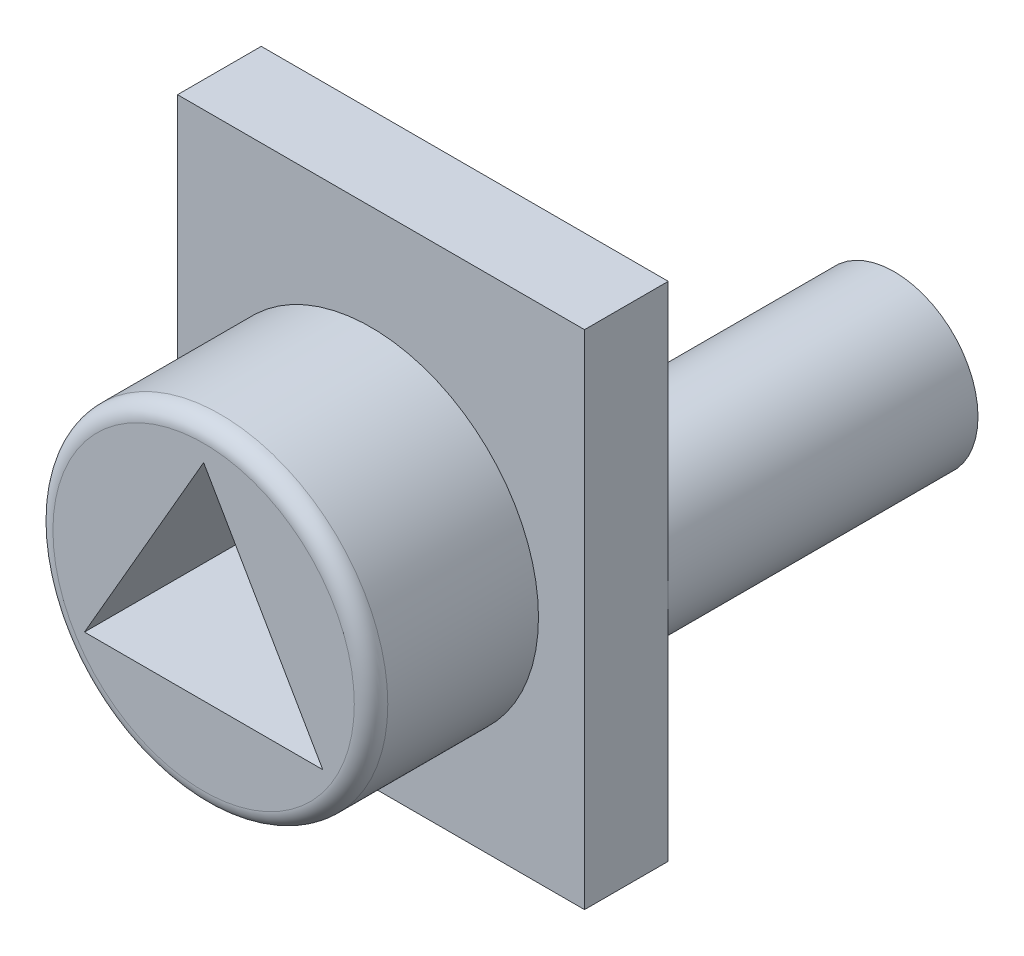
ISO-10303-21;
HEADER;
FILE_DESCRIPTION(('STEP AP214'),'2;1');
FILE_NAME('part.step','',(''),(''),'','','');
FILE_SCHEMA(('AUTOMOTIVE_DESIGN { 1 0 10303 214 1 1 1 1 }'));
ENDSEC;
DATA;
#1=APPLICATION_CONTEXT('core data for automotive mechanical design processes');
#2=APPLICATION_PROTOCOL_DEFINITION('international standard','automotive_design',2000,#1);
#3=PRODUCT_CONTEXT('',#1,'mechanical');
#4=PRODUCT('Part','Part','',(#3));
#5=PRODUCT_RELATED_PRODUCT_CATEGORY('part','',(#4));
#6=PRODUCT_DEFINITION_FORMATION('','',#4);
#7=PRODUCT_DEFINITION_CONTEXT('part definition',#1,'design');
#8=PRODUCT_DEFINITION('design','',#6,#7);
#9=PRODUCT_DEFINITION_SHAPE('','',#8);
#10=(LENGTH_UNIT() NAMED_UNIT(*) SI_UNIT(.MILLI.,.METRE.));
#11=(NAMED_UNIT(*) PLANE_ANGLE_UNIT() SI_UNIT($,.RADIAN.));
#12=(NAMED_UNIT(*) SI_UNIT($,.STERADIAN.) SOLID_ANGLE_UNIT());
#13=UNCERTAINTY_MEASURE_WITH_UNIT(LENGTH_MEASURE(1.E-05),#10,'distance_accuracy_value','');
#14=(GEOMETRIC_REPRESENTATION_CONTEXT(3) GLOBAL_UNCERTAINTY_ASSIGNED_CONTEXT((#13)) GLOBAL_UNIT_ASSIGNED_CONTEXT((#10,
#11,#12)) REPRESENTATION_CONTEXT('',''));
#15=CARTESIAN_POINT('',(0.,0.,0.));
#16=DIRECTION('',(0.,0.,1.));
#17=DIRECTION('',(1.,0.,0.));
#18=AXIS2_PLACEMENT_3D('',#15,#16,#17);
#19=CARTESIAN_POINT('',(0.,0.,2.));
#20=DIRECTION('',(0.,0.,1.));
#21=DIRECTION('',(1.,0.,0.));
#22=AXIS2_PLACEMENT_3D('',#19,#20,#21);
#23=PLANE('',#22);
#24=DIRECTION('',(0.,-1.,0.));
#25=VECTOR('',#24,1.);
#26=CARTESIAN_POINT('',(-4.86158362662732,6.,2.));
#27=LINE('',#26,#25);
#28=CARTESIAN_POINT('',(-4.86158362662732,6.,2.));
#29=VERTEX_POINT('',#28);
#30=CARTESIAN_POINT('',(-4.86158362662732,-6.,2.));
#31=VERTEX_POINT('',#30);
#32=EDGE_CURVE('E122',#29,#31,#27,.T.);
#33=ORIENTED_EDGE('',*,*,#32,.T.);
#34=DIRECTION('',(1.,0.,0.));
#35=VECTOR('',#34,1.);
#36=CARTESIAN_POINT('',(-4.86158362662732,-6.,2.));
#37=LINE('',#36,#35);
#38=CARTESIAN_POINT('',(4.86158362662732,-6.,2.));
#39=VERTEX_POINT('',#38);
#40=EDGE_CURVE('E217',#31,#39,#37,.T.);
#41=ORIENTED_EDGE('',*,*,#40,.T.);
#42=DIRECTION('',(0.,1.,0.));
#43=VECTOR('',#42,1.);
#44=CARTESIAN_POINT('',(4.86158362662732,-6.,2.));
#45=LINE('',#44,#43);
#46=CARTESIAN_POINT('',(4.86158362662732,6.,2.));
#47=VERTEX_POINT('',#46);
#48=EDGE_CURVE('E219',#39,#47,#45,.T.);
#49=ORIENTED_EDGE('',*,*,#48,.T.);
#50=DIRECTION('',(-1.,0.,0.));
#51=VECTOR('',#50,1.);
#52=CARTESIAN_POINT('',(4.86158362662732,6.,2.));
#53=LINE('',#52,#51);
#54=EDGE_CURVE('E127',#47,#29,#53,.T.);
#55=ORIENTED_EDGE('',*,*,#54,.T.);
#56=EDGE_LOOP('',(#33,#41,#49,#55));
#57=FACE_BOUND('',#56,.T.);
#58=CARTESIAN_POINT('',(-0.238416373372685,-0.5,2.));
#59=DIRECTION('',(0.,0.,1.));
#60=DIRECTION('',(1.,0.,0.));
#61=AXIS2_PLACEMENT_3D('',#58,#59,#60);
#62=CIRCLE('',#61,4.00000000000001);
#63=CARTESIAN_POINT('',(3.76158362662732,-0.5,2.));
#64=VERTEX_POINT('',#63);
#65=EDGE_CURVE('E213',#64,#64,#62,.T.);
#66=ORIENTED_EDGE('',*,*,#65,.F.);
#67=EDGE_LOOP('',(#66));
#68=FACE_BOUND('',#67,.T.);
#69=ADVANCED_FACE('F38',(#57,#68),#23,.T.);
#70=CARTESIAN_POINT('',(-4.86158362662732,6.,2.));
#71=DIRECTION('',(1.,0.,0.));
#72=DIRECTION('',(0.,0.,-1.));
#73=AXIS2_PLACEMENT_3D('',#70,#71,#72);
#74=PLANE('',#73);
#75=DIRECTION('',(0.,-1.,0.));
#76=VECTOR('',#75,1.);
#77=CARTESIAN_POINT('',(-4.86158362662732,6.,0.));
#78=LINE('',#77,#76);
#79=CARTESIAN_POINT('',(-4.86158362662732,6.,0.));
#80=VERTEX_POINT('',#79);
#81=CARTESIAN_POINT('',(-4.86158362662732,-6.,0.));
#82=VERTEX_POINT('',#81);
#83=EDGE_CURVE('E117',#80,#82,#78,.T.);
#84=ORIENTED_EDGE('',*,*,#83,.T.);
#85=DIRECTION('',(0.,0.,-1.));
#86=VECTOR('',#85,1.);
#87=CARTESIAN_POINT('',(-4.86158362662732,-6.,2.));
#88=LINE('',#87,#86);
#89=EDGE_CURVE('E130',#31,#82,#88,.T.);
#90=ORIENTED_EDGE('',*,*,#89,.F.);
#91=ORIENTED_EDGE('',*,*,#32,.F.);
#92=DIRECTION('',(0.,0.,-1.));
#93=VECTOR('',#92,1.);
#94=CARTESIAN_POINT('',(-4.86158362662732,6.,2.));
#95=LINE('',#94,#93);
#96=EDGE_CURVE('E123',#29,#80,#95,.T.);
#97=ORIENTED_EDGE('',*,*,#96,.T.);
#98=EDGE_LOOP('',(#84,#90,#91,#97));
#99=FACE_BOUND('',#98,.T.);
#100=ADVANCED_FACE('F153',(#99),#74,.F.);
#101=CARTESIAN_POINT('',(-4.86158362662732,-6.,2.));
#102=DIRECTION('',(0.,1.,0.));
#103=DIRECTION('',(0.,0.,1.));
#104=AXIS2_PLACEMENT_3D('',#101,#102,#103);
#105=PLANE('',#104);
#106=DIRECTION('',(1.,0.,0.));
#107=VECTOR('',#106,1.);
#108=CARTESIAN_POINT('',(-4.86158362662732,-6.,0.));
#109=LINE('',#108,#107);
#110=CARTESIAN_POINT('',(4.86158362662732,-6.,0.));
#111=VERTEX_POINT('',#110);
#112=EDGE_CURVE('E116',#82,#111,#109,.T.);
#113=ORIENTED_EDGE('',*,*,#112,.T.);
#114=DIRECTION('',(0.,0.,-1.));
#115=VECTOR('',#114,1.);
#116=CARTESIAN_POINT('',(4.86158362662732,-6.,2.));
#117=LINE('',#116,#115);
#118=EDGE_CURVE('E106',#39,#111,#117,.T.);
#119=ORIENTED_EDGE('',*,*,#118,.F.);
#120=ORIENTED_EDGE('',*,*,#40,.F.);
#121=ORIENTED_EDGE('',*,*,#89,.T.);
#122=EDGE_LOOP('',(#113,#119,#120,#121));
#123=FACE_BOUND('',#122,.T.);
#124=ADVANCED_FACE('F160',(#123),#105,.F.);
#125=CARTESIAN_POINT('',(4.86158362662732,-6.,2.));
#126=DIRECTION('',(-1.,0.,0.));
#127=DIRECTION('',(0.,0.,1.));
#128=AXIS2_PLACEMENT_3D('',#125,#126,#127);
#129=PLANE('',#128);
#130=DIRECTION('',(0.,1.,0.));
#131=VECTOR('',#130,1.);
#132=CARTESIAN_POINT('',(4.86158362662732,-6.,0.));
#133=LINE('',#132,#131);
#134=CARTESIAN_POINT('',(4.86158362662732,-0.5,0.));
#135=VERTEX_POINT('',#134);
#136=EDGE_CURVE('E98',#111,#135,#133,.T.);
#137=ORIENTED_EDGE('',*,*,#136,.T.);
#138=CARTESIAN_POINT('',(4.86158362662732,6.,0.));
#139=VERTEX_POINT('',#138);
#140=EDGE_CURVE('E102',#135,#139,#133,.T.);
#141=ORIENTED_EDGE('',*,*,#140,.T.);
#142=DIRECTION('',(0.,0.,-1.));
#143=VECTOR('',#142,1.);
#144=CARTESIAN_POINT('',(4.86158362662732,6.,2.));
#145=LINE('',#144,#143);
#146=EDGE_CURVE('E126',#47,#139,#145,.T.);
#147=ORIENTED_EDGE('',*,*,#146,.F.);
#148=ORIENTED_EDGE('',*,*,#48,.F.);
#149=ORIENTED_EDGE('',*,*,#118,.T.);
#150=EDGE_LOOP('',(#137,#141,#147,#148,#149));
#151=FACE_BOUND('',#150,.T.);
#152=ADVANCED_FACE('F100',(#151),#129,.F.);
#153=CARTESIAN_POINT('',(4.86158362662732,6.,2.));
#154=DIRECTION('',(0.,-1.,0.));
#155=DIRECTION('',(0.,0.,-1.));
#156=AXIS2_PLACEMENT_3D('',#153,#154,#155);
#157=PLANE('',#156);
#158=DIRECTION('',(-1.,0.,0.));
#159=VECTOR('',#158,1.);
#160=CARTESIAN_POINT('',(4.86158362662732,6.,0.));
#161=LINE('',#160,#159);
#162=EDGE_CURVE('E109',#139,#80,#161,.T.);
#163=ORIENTED_EDGE('',*,*,#162,.T.);
#164=ORIENTED_EDGE('',*,*,#96,.F.);
#165=ORIENTED_EDGE('',*,*,#54,.F.);
#166=ORIENTED_EDGE('',*,*,#146,.T.);
#167=EDGE_LOOP('',(#163,#164,#165,#166));
#168=FACE_BOUND('',#167,.T.);
#169=ADVANCED_FACE('F228',(#168),#157,.F.);
#170=CARTESIAN_POINT('',(0.,0.,0.));
#171=DIRECTION('',(0.,0.,1.));
#172=DIRECTION('',(1.,0.,0.));
#173=AXIS2_PLACEMENT_3D('',#170,#171,#172);
#174=PLANE('',#173);
#175=CARTESIAN_POINT('',(-0.238416373372673,-0.580000000000002,0.));
#176=DIRECTION('',(0.,0.,1.));
#177=DIRECTION('',(1.,0.,0.));
#178=AXIS2_PLACEMENT_3D('',#175,#176,#177);
#179=CIRCLE('',#178,1.1);
#180=CARTESIAN_POINT('',(0.861583626627327,-0.580000000000002,0.));
#181=VERTEX_POINT('',#180);
#182=EDGE_CURVE('E184',#181,#181,#179,.T.);
#183=ORIENTED_EDGE('',*,*,#182,.T.);
#184=EDGE_LOOP('',(#183));
#185=FACE_BOUND('',#184,.T.);
#186=ORIENTED_EDGE('',*,*,#140,.F.);
#187=CARTESIAN_POINT('',(2.86158362662732,-0.5,0.));
#188=DIRECTION('',(0.,0.,-1.));
#189=DIRECTION('',(-1.,0.,0.));
#190=AXIS2_PLACEMENT_3D('',#187,#188,#189);
#191=CIRCLE('',#190,2.);
#192=EDGE_CURVE('E114',#135,#135,#191,.T.);
#193=ORIENTED_EDGE('',*,*,#192,.F.);
#194=ORIENTED_EDGE('',*,*,#136,.F.);
#195=ORIENTED_EDGE('',*,*,#112,.F.);
#196=ORIENTED_EDGE('',*,*,#83,.F.);
#197=ORIENTED_EDGE('',*,*,#162,.F.);
#198=EDGE_LOOP('',(#186,#193,#194,#195,#196,#197));
#199=FACE_BOUND('',#198,.T.);
#200=ADVANCED_FACE('F112',(#185,#199),#174,.F.);
#201=CARTESIAN_POINT('',(-0.238416373372685,-0.5,6.));
#202=DIRECTION('',(0.,0.,1.));
#203=DIRECTION('',(1.,0.,0.));
#204=AXIS2_PLACEMENT_3D('',#201,#202,#203);
#205=PLANE('',#204);
#206=CARTESIAN_POINT('',(-0.238416373372685,-0.5,6.));
#207=DIRECTION('',(0.,0.,1.));
#208=DIRECTION('',(1.,0.,0.));
#209=AXIS2_PLACEMENT_3D('',#206,#207,#208);
#210=CIRCLE('',#209,3.60000000000001);
#211=CARTESIAN_POINT('',(3.36158362662732,-0.5,6.));
#212=VERTEX_POINT('',#211);
#213=EDGE_CURVE('E46',#212,#212,#210,.T.);
#214=ORIENTED_EDGE('',*,*,#213,.T.);
#215=EDGE_LOOP('',(#214));
#216=FACE_BOUND('',#215,.T.);
#217=DIRECTION('',(-0.5,0.866025403784439,0.));
#218=VECTOR('',#217,1.);
#219=CARTESIAN_POINT('',(-0.238416373372674,2.7,6.));
#220=LINE('',#219,#218);
#221=CARTESIAN_POINT('',(2.60799378814109,-2.23012701892218,6.));
#222=VERTEX_POINT('',#221);
#223=CARTESIAN_POINT('',(-0.238416373372674,2.7,6.));
#224=VERTEX_POINT('',#223);
#225=EDGE_CURVE('E195',#222,#224,#220,.T.);
#226=ORIENTED_EDGE('',*,*,#225,.F.);
#227=DIRECTION('',(1.,0.,0.));
#228=VECTOR('',#227,1.);
#229=CARTESIAN_POINT('',(2.60799378814109,-2.23012701892218,6.));
#230=LINE('',#229,#228);
#231=CARTESIAN_POINT('',(-3.08482653488644,-2.23012701892218,6.));
#232=VERTEX_POINT('',#231);
#233=EDGE_CURVE('E193',#232,#222,#230,.T.);
#234=ORIENTED_EDGE('',*,*,#233,.F.);
#235=DIRECTION('',(-0.5,-0.866025403784439,0.));
#236=VECTOR('',#235,1.);
#237=CARTESIAN_POINT('',(-3.08482653488644,-2.23012701892218,6.));
#238=LINE('',#237,#236);
#239=EDGE_CURVE('E198',#224,#232,#238,.T.);
#240=ORIENTED_EDGE('',*,*,#239,.F.);
#241=EDGE_LOOP('',(#226,#234,#240));
#242=FACE_BOUND('',#241,.T.);
#243=ADVANCED_FACE('F135',(#216,#242),#205,.T.);
#244=CARTESIAN_POINT('',(-0.238416373372685,-0.5,6.));
#245=DIRECTION('',(0.,0.,-1.));
#246=DIRECTION('',(-1.,0.,0.));
#247=AXIS2_PLACEMENT_3D('',#244,#245,#246);
#248=CYLINDRICAL_SURFACE('',#247,4.00000000000001);
#249=CARTESIAN_POINT('',(-0.238416373372685,-0.5,5.6));
#250=DIRECTION('',(0.,0.,1.));
#251=DIRECTION('',(1.,0.,0.));
#252=AXIS2_PLACEMENT_3D('',#249,#250,#251);
#253=CIRCLE('',#252,4.00000000000001);
#254=CARTESIAN_POINT('',(3.76158362662732,-0.5,5.6));
#255=VERTEX_POINT('',#254);
#256=EDGE_CURVE('E11',#255,#255,#253,.F.);
#257=ORIENTED_EDGE('',*,*,#256,.T.);
#258=EDGE_LOOP('',(#257));
#259=FACE_BOUND('',#258,.T.);
#260=ORIENTED_EDGE('',*,*,#65,.T.);
#261=EDGE_LOOP('',(#260));
#262=FACE_BOUND('',#261,.T.);
#263=ADVANCED_FACE('F276',(#259,#262),#248,.T.);
#264=CARTESIAN_POINT('',(2.60799378814109,-2.23012701892218,6.));
#265=DIRECTION('',(0.,1.,0.));
#266=DIRECTION('',(-1.,0.,0.));
#267=AXIS2_PLACEMENT_3D('',#264,#265,#266);
#268=PLANE('',#267);
#269=DIRECTION('',(1.,0.,0.));
#270=VECTOR('',#269,1.);
#271=CARTESIAN_POINT('',(2.60799378814109,-2.23012701892218,2.));
#272=LINE('',#271,#270);
#273=CARTESIAN_POINT('',(-3.08482653488644,-2.23012701892218,2.));
#274=VERTEX_POINT('',#273);
#275=CARTESIAN_POINT('',(2.60799378814109,-2.23012701892218,2.));
#276=VERTEX_POINT('',#275);
#277=EDGE_CURVE('E53',#274,#276,#272,.T.);
#278=ORIENTED_EDGE('',*,*,#277,.F.);
#279=DIRECTION('',(0.,0.,-1.));
#280=VECTOR('',#279,1.);
#281=CARTESIAN_POINT('',(-3.08482653488644,-2.23012701892218,6.));
#282=LINE('',#281,#280);
#283=EDGE_CURVE('E200',#232,#274,#282,.T.);
#284=ORIENTED_EDGE('',*,*,#283,.F.);
#285=ORIENTED_EDGE('',*,*,#233,.T.);
#286=DIRECTION('',(0.,0.,-1.));
#287=VECTOR('',#286,1.);
#288=CARTESIAN_POINT('',(2.60799378814109,-2.23012701892218,6.));
#289=LINE('',#288,#287);
#290=EDGE_CURVE('E210',#222,#276,#289,.T.);
#291=ORIENTED_EDGE('',*,*,#290,.T.);
#292=EDGE_LOOP('',(#278,#284,#285,#291));
#293=FACE_BOUND('',#292,.T.);
#294=ADVANCED_FACE('F282',(#293),#268,.T.);
#295=CARTESIAN_POINT('',(-0.238416373372674,2.7,6.));
#296=DIRECTION('',(-0.866025403784439,-0.5,0.));
#297=DIRECTION('',(0.5,-0.866025403784439,0.));
#298=AXIS2_PLACEMENT_3D('',#295,#296,#297);
#299=PLANE('',#298);
#300=DIRECTION('',(-0.5,0.866025403784439,0.));
#301=VECTOR('',#300,1.);
#302=CARTESIAN_POINT('',(-0.238416373372674,2.7,2.));
#303=LINE('',#302,#301);
#304=CARTESIAN_POINT('',(-0.238416373372674,2.7,2.));
#305=VERTEX_POINT('',#304);
#306=EDGE_CURVE('E202',#276,#305,#303,.T.);
#307=ORIENTED_EDGE('',*,*,#306,.F.);
#308=ORIENTED_EDGE('',*,*,#290,.F.);
#309=ORIENTED_EDGE('',*,*,#225,.T.);
#310=DIRECTION('',(0.,0.,-1.));
#311=VECTOR('',#310,1.);
#312=CARTESIAN_POINT('',(-0.238416373372674,2.7,6.));
#313=LINE('',#312,#311);
#314=EDGE_CURVE('E207',#224,#305,#313,.T.);
#315=ORIENTED_EDGE('',*,*,#314,.T.);
#316=EDGE_LOOP('',(#307,#308,#309,#315));
#317=FACE_BOUND('',#316,.T.);
#318=ADVANCED_FACE('F177',(#317),#299,.T.);
#319=CARTESIAN_POINT('',(-3.08482653488644,-2.23012701892218,6.));
#320=DIRECTION('',(0.866025403784439,-0.5,0.));
#321=DIRECTION('',(0.5,0.866025403784439,0.));
#322=AXIS2_PLACEMENT_3D('',#319,#320,#321);
#323=PLANE('',#322);
#324=DIRECTION('',(-0.5,-0.866025403784439,0.));
#325=VECTOR('',#324,1.);
#326=CARTESIAN_POINT('',(-3.08482653488644,-2.23012701892218,2.));
#327=LINE('',#326,#325);
#328=EDGE_CURVE('E57',#305,#274,#327,.T.);
#329=ORIENTED_EDGE('',*,*,#328,.F.);
#330=ORIENTED_EDGE('',*,*,#314,.F.);
#331=ORIENTED_EDGE('',*,*,#239,.T.);
#332=ORIENTED_EDGE('',*,*,#283,.T.);
#333=EDGE_LOOP('',(#329,#330,#331,#332));
#334=FACE_BOUND('',#333,.T.);
#335=ADVANCED_FACE('F167',(#334),#323,.T.);
#336=CARTESIAN_POINT('',(-0.238416373372673,-0.580000000000002,2.));
#337=DIRECTION('',(0.,0.,1.));
#338=DIRECTION('',(1.,0.,0.));
#339=AXIS2_PLACEMENT_3D('',#336,#337,#338);
#340=CIRCLE('',#339,1.1);
#341=CARTESIAN_POINT('',(0.861583626627327,-0.580000000000002,2.));
#342=VERTEX_POINT('',#341);
#343=EDGE_CURVE('E182',#342,#342,#340,.T.);
#344=ORIENTED_EDGE('',*,*,#343,.F.);
#345=EDGE_LOOP('',(#344));
#346=FACE_BOUND('',#345,.T.);
#347=ORIENTED_EDGE('',*,*,#277,.T.);
#348=ORIENTED_EDGE('',*,*,#306,.T.);
#349=ORIENTED_EDGE('',*,*,#328,.T.);
#350=EDGE_LOOP('',(#347,#348,#349));
#351=FACE_BOUND('',#350,.T.);
#352=ADVANCED_FACE('F156',(#346,#351),#23,.T.);
#353=CARTESIAN_POINT('',(2.86158362662732,-0.5,-7.4));
#354=DIRECTION('',(0.,0.,1.));
#355=DIRECTION('',(1.,0.,0.));
#356=AXIS2_PLACEMENT_3D('',#353,#354,#355);
#357=CYLINDRICAL_SURFACE('',#356,2.);
#358=CARTESIAN_POINT('',(2.86158362662732,-0.5,-7.4));
#359=DIRECTION('',(0.,0.,-1.));
#360=DIRECTION('',(-1.,0.,0.));
#361=AXIS2_PLACEMENT_3D('',#358,#359,#360);
#362=CIRCLE('',#361,2.);
#363=CARTESIAN_POINT('',(0.861583626627324,-0.5,-7.4));
#364=VERTEX_POINT('',#363);
#365=EDGE_CURVE('E189',#364,#364,#362,.T.);
#366=ORIENTED_EDGE('',*,*,#365,.F.);
#367=EDGE_LOOP('',(#366));
#368=FACE_BOUND('',#367,.T.);
#369=ORIENTED_EDGE('',*,*,#192,.T.);
#370=EDGE_LOOP('',(#369));
#371=FACE_BOUND('',#370,.T.);
#372=ADVANCED_FACE('F148',(#368,#371),#357,.T.);
#373=CARTESIAN_POINT('',(2.86158362662732,-0.5,-7.4));
#374=DIRECTION('',(0.,0.,-1.));
#375=DIRECTION('',(-1.,0.,0.));
#376=AXIS2_PLACEMENT_3D('',#373,#374,#375);
#377=PLANE('',#376);
#378=ORIENTED_EDGE('',*,*,#365,.T.);
#379=EDGE_LOOP('',(#378));
#380=FACE_BOUND('',#379,.T.);
#381=ADVANCED_FACE('F140',(#380),#377,.T.);
#382=CARTESIAN_POINT('',(-0.238416373372685,-0.5,5.6));
#383=DIRECTION('',(0.,0.,1.));
#384=DIRECTION('',(1.,0.,0.));
#385=AXIS2_PLACEMENT_3D('',#382,#383,#384);
#386=TOROIDAL_SURFACE('',#385,3.60000000000001,0.4);
#387=ORIENTED_EDGE('',*,*,#256,.F.);
#388=EDGE_LOOP('',(#387));
#389=FACE_BOUND('',#388,.T.);
#390=ORIENTED_EDGE('',*,*,#213,.F.);
#391=EDGE_LOOP('',(#390));
#392=FACE_BOUND('',#391,.T.);
#393=ADVANCED_FACE('F40',(#389,#392),#386,.T.);
#394=CARTESIAN_POINT('',(-0.238416373372673,-0.580000000000002,0.));
#395=DIRECTION('',(0.,0.,1.));
#396=DIRECTION('',(1.,0.,0.));
#397=AXIS2_PLACEMENT_3D('',#394,#395,#396);
#398=CYLINDRICAL_SURFACE('',#397,1.1);
#399=ORIENTED_EDGE('',*,*,#182,.F.);
#400=EDGE_LOOP('',(#399));
#401=FACE_BOUND('',#400,.T.);
#402=ORIENTED_EDGE('',*,*,#343,.T.);
#403=EDGE_LOOP('',(#402));
#404=FACE_BOUND('',#403,.T.);
#405=ADVANCED_FACE('F139',(#401,#404),#398,.F.);
#406=CLOSED_SHELL('',(#69,#100,#124,#152,#169,#200,#243,#263,#294,#318,#335,#352,#372,#381,#393,#405));
#407=MANIFOLD_SOLID_BREP('B2',#406);
#408=ADVANCED_BREP_SHAPE_REPRESENTATION('',(#18,#407),#14);
#409=SHAPE_DEFINITION_REPRESENTATION(#9,#408);
ENDSEC;
END-ISO-10303-21;
